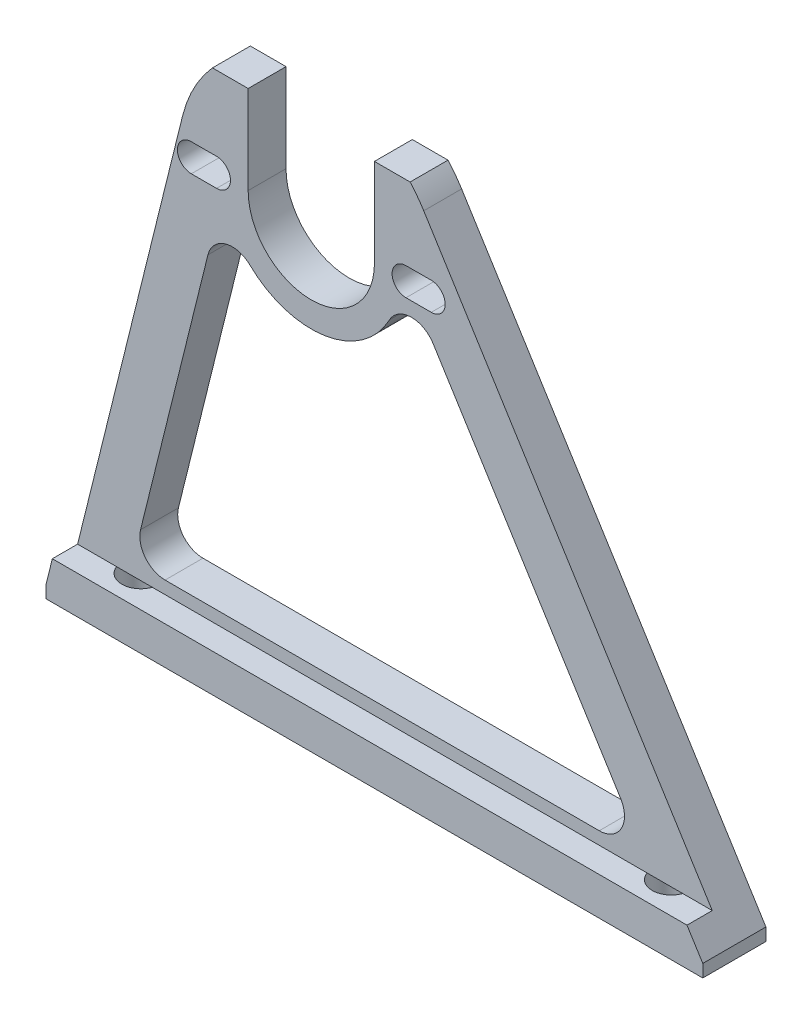
ISO-10303-21;
HEADER;
FILE_DESCRIPTION(('STEP AP214'),'2;1');
FILE_NAME('part.step','',(''),(''),'','','');
FILE_SCHEMA(('AUTOMOTIVE_DESIGN { 1 0 10303 214 1 1 1 1 }'));
ENDSEC;
DATA;
#1=APPLICATION_CONTEXT('core data for automotive mechanical design processes');
#2=APPLICATION_PROTOCOL_DEFINITION('international standard','automotive_design',2000,#1);
#3=PRODUCT_CONTEXT('',#1,'mechanical');
#4=PRODUCT('Part','Part','',(#3));
#5=PRODUCT_RELATED_PRODUCT_CATEGORY('part','',(#4));
#6=PRODUCT_DEFINITION_FORMATION('','',#4);
#7=PRODUCT_DEFINITION_CONTEXT('part definition',#1,'design');
#8=PRODUCT_DEFINITION('design','',#6,#7);
#9=PRODUCT_DEFINITION_SHAPE('','',#8);
#10=(LENGTH_UNIT() NAMED_UNIT(*) SI_UNIT(.MILLI.,.METRE.));
#11=(NAMED_UNIT(*) PLANE_ANGLE_UNIT() SI_UNIT($,.RADIAN.));
#12=(NAMED_UNIT(*) SI_UNIT($,.STERADIAN.) SOLID_ANGLE_UNIT());
#13=UNCERTAINTY_MEASURE_WITH_UNIT(LENGTH_MEASURE(1.E-05),#10,'distance_accuracy_value','');
#14=(GEOMETRIC_REPRESENTATION_CONTEXT(3) GLOBAL_UNCERTAINTY_ASSIGNED_CONTEXT((#13)) GLOBAL_UNIT_ASSIGNED_CONTEXT((#10,
#11,#12)) REPRESENTATION_CONTEXT('',''));
#15=CARTESIAN_POINT('',(0.,0.,0.));
#16=DIRECTION('',(0.,0.,1.));
#17=DIRECTION('',(1.,0.,0.));
#18=AXIS2_PLACEMENT_3D('',#15,#16,#17);
#19=CARTESIAN_POINT('',(0.,0.,5.));
#20=DIRECTION('',(0.,0.,-1.));
#21=DIRECTION('',(-1.,0.,0.));
#22=AXIS2_PLACEMENT_3D('',#19,#20,#21);
#23=CYLINDRICAL_SURFACE('',#22,10.5);
#24=CARTESIAN_POINT('',(0.,0.,3.));
#25=DIRECTION('',(0.,0.,1.));
#26=DIRECTION('',(1.,0.,0.));
#27=AXIS2_PLACEMENT_3D('',#24,#25,#26);
#28=CIRCLE('',#27,10.5);
#29=CARTESIAN_POINT('',(-7.82623792124927,7.,3.));
#30=VERTEX_POINT('',#29);
#31=CARTESIAN_POINT('',(-10.1914133471424,2.52687435138502,3.));
#32=VERTEX_POINT('',#31);
#33=EDGE_CURVE('E330',#30,#32,#28,.T.);
#34=ORIENTED_EDGE('',*,*,#33,.F.);
#35=DIRECTION('',(0.,0.,-1.));
#36=VECTOR('',#35,1.);
#37=CARTESIAN_POINT('',(-7.82623792124927,7.,5.));
#38=LINE('',#37,#36);
#39=CARTESIAN_POINT('',(-7.82623792124927,7.,0.));
#40=VERTEX_POINT('',#39);
#41=EDGE_CURVE('E430',#30,#40,#38,.T.);
#42=ORIENTED_EDGE('',*,*,#41,.T.);
#43=CARTESIAN_POINT('',(0.,0.,0.));
#44=DIRECTION('',(0.,0.,1.));
#45=DIRECTION('',(1.,0.,0.));
#46=AXIS2_PLACEMENT_3D('',#43,#44,#45);
#47=CIRCLE('',#46,10.5);
#48=CARTESIAN_POINT('',(-10.1914133471424,2.52687435138502,0.));
#49=VERTEX_POINT('',#48);
#50=EDGE_CURVE('E417',#40,#49,#47,.T.);
#51=ORIENTED_EDGE('',*,*,#50,.T.);
#52=DIRECTION('',(0.,0.,-1.));
#53=VECTOR('',#52,1.);
#54=CARTESIAN_POINT('',(-10.1914133471424,2.52687435138502,5.));
#55=LINE('',#54,#53);
#56=EDGE_CURVE('E486',#32,#49,#55,.T.);
#57=ORIENTED_EDGE('',*,*,#56,.F.);
#58=EDGE_LOOP('',(#34,#42,#51,#57));
#59=FACE_BOUND('',#58,.T.);
#60=ADVANCED_FACE('F34',(#59),#23,.T.);
#61=CARTESIAN_POINT('',(0.,0.,5.));
#62=DIRECTION('',(0.,0.,-1.));
#63=DIRECTION('',(-1.,0.,0.));
#64=AXIS2_PLACEMENT_3D('',#61,#62,#63);
#65=CYLINDRICAL_SURFACE('',#64,10.5);
#66=CARTESIAN_POINT('',(0.,0.,3.));
#67=DIRECTION('',(0.,0.,1.));
#68=DIRECTION('',(1.,0.,0.));
#69=AXIS2_PLACEMENT_3D('',#66,#67,#68);
#70=CIRCLE('',#69,10.5);
#71=CARTESIAN_POINT('',(8.90471895944788,5.56380986853878,3.));
#72=VERTEX_POINT('',#71);
#73=CARTESIAN_POINT('',(7.82623792124927,7.,3.));
#74=VERTEX_POINT('',#73);
#75=EDGE_CURVE('E326',#72,#74,#70,.T.);
#76=ORIENTED_EDGE('',*,*,#75,.F.);
#77=DIRECTION('',(0.,0.,-1.));
#78=VECTOR('',#77,1.);
#79=CARTESIAN_POINT('',(8.90471895944788,5.56380986853878,5.));
#80=LINE('',#79,#78);
#81=CARTESIAN_POINT('',(8.90471895944788,5.56380986853878,0.));
#82=VERTEX_POINT('',#81);
#83=EDGE_CURVE('E472',#72,#82,#80,.T.);
#84=ORIENTED_EDGE('',*,*,#83,.T.);
#85=CARTESIAN_POINT('',(0.,0.,0.));
#86=DIRECTION('',(0.,0.,1.));
#87=DIRECTION('',(1.,0.,0.));
#88=AXIS2_PLACEMENT_3D('',#85,#86,#87);
#89=CIRCLE('',#88,10.5);
#90=CARTESIAN_POINT('',(7.82623792124927,7.,0.));
#91=VERTEX_POINT('',#90);
#92=EDGE_CURVE('E444',#82,#91,#89,.T.);
#93=ORIENTED_EDGE('',*,*,#92,.T.);
#94=DIRECTION('',(0.,0.,-1.));
#95=VECTOR('',#94,1.);
#96=CARTESIAN_POINT('',(7.82623792124927,7.,5.));
#97=LINE('',#96,#95);
#98=EDGE_CURVE('E470',#74,#91,#97,.T.);
#99=ORIENTED_EDGE('',*,*,#98,.F.);
#100=EDGE_LOOP('',(#76,#84,#93,#99));
#101=FACE_BOUND('',#100,.T.);
#102=ADVANCED_FACE('F518',(#101),#65,.T.);
#103=CARTESIAN_POINT('',(5.,7.,5.));
#104=DIRECTION('',(0.,-1.,0.));
#105=DIRECTION('',(0.,0.,-1.));
#106=AXIS2_PLACEMENT_3D('',#103,#104,#105);
#107=PLANE('',#106);
#108=DIRECTION('',(-1.,0.,0.));
#109=VECTOR('',#108,1.);
#110=CARTESIAN_POINT('',(5.,7.,3.));
#111=LINE('',#110,#109);
#112=CARTESIAN_POINT('',(5.,7.,3.));
#113=VERTEX_POINT('',#112);
#114=EDGE_CURVE('E324',#74,#113,#111,.T.);
#115=ORIENTED_EDGE('',*,*,#114,.F.);
#116=ORIENTED_EDGE('',*,*,#98,.T.);
#117=DIRECTION('',(-1.,0.,0.));
#118=VECTOR('',#117,1.);
#119=CARTESIAN_POINT('',(5.,7.,0.));
#120=LINE('',#119,#118);
#121=CARTESIAN_POINT('',(5.,7.,0.));
#122=VERTEX_POINT('',#121);
#123=EDGE_CURVE('E447',#91,#122,#120,.T.);
#124=ORIENTED_EDGE('',*,*,#123,.T.);
#125=DIRECTION('',(0.,0.,-1.));
#126=VECTOR('',#125,1.);
#127=CARTESIAN_POINT('',(5.,7.,5.));
#128=LINE('',#127,#126);
#129=EDGE_CURVE('E468',#113,#122,#128,.T.);
#130=ORIENTED_EDGE('',*,*,#129,.F.);
#131=EDGE_LOOP('',(#115,#116,#124,#130));
#132=FACE_BOUND('',#131,.T.);
#133=ADVANCED_FACE('F523',(#132),#107,.F.);
#134=CARTESIAN_POINT('',(5.,0.,5.));
#135=DIRECTION('',(1.,0.,0.));
#136=DIRECTION('',(0.,1.,0.));
#137=AXIS2_PLACEMENT_3D('',#134,#135,#136);
#138=PLANE('',#137);
#139=DIRECTION('',(0.,-1.,0.));
#140=VECTOR('',#139,1.);
#141=CARTESIAN_POINT('',(5.,0.,3.));
#142=LINE('',#141,#140);
#143=CARTESIAN_POINT('',(5.,0.,3.));
#144=VERTEX_POINT('',#143);
#145=EDGE_CURVE('E322',#113,#144,#142,.T.);
#146=ORIENTED_EDGE('',*,*,#145,.F.);
#147=ORIENTED_EDGE('',*,*,#129,.T.);
#148=DIRECTION('',(0.,-1.,0.));
#149=VECTOR('',#148,1.);
#150=CARTESIAN_POINT('',(5.,0.,0.));
#151=LINE('',#150,#149);
#152=CARTESIAN_POINT('',(5.,0.,0.));
#153=VERTEX_POINT('',#152);
#154=EDGE_CURVE('E450',#122,#153,#151,.T.);
#155=ORIENTED_EDGE('',*,*,#154,.T.);
#156=DIRECTION('',(0.,0.,-1.));
#157=VECTOR('',#156,1.);
#158=CARTESIAN_POINT('',(5.,0.,5.));
#159=LINE('',#158,#157);
#160=EDGE_CURVE('E466',#144,#153,#159,.T.);
#161=ORIENTED_EDGE('',*,*,#160,.F.);
#162=EDGE_LOOP('',(#146,#147,#155,#161));
#163=FACE_BOUND('',#162,.T.);
#164=ADVANCED_FACE('F591',(#163),#138,.F.);
#165=CARTESIAN_POINT('',(0.,0.,5.));
#166=DIRECTION('',(0.,0.,-1.));
#167=DIRECTION('',(-1.,0.,0.));
#168=AXIS2_PLACEMENT_3D('',#165,#166,#167);
#169=CYLINDRICAL_SURFACE('',#168,5.);
#170=CARTESIAN_POINT('',(0.,0.,3.));
#171=DIRECTION('',(0.,0.,1.));
#172=DIRECTION('',(1.,0.,0.));
#173=AXIS2_PLACEMENT_3D('',#170,#171,#172);
#174=CIRCLE('',#173,5.);
#175=CARTESIAN_POINT('',(-5.,0.,3.));
#176=VERTEX_POINT('',#175);
#177=EDGE_CURVE('E320',#144,#176,#174,.F.);
#178=ORIENTED_EDGE('',*,*,#177,.F.);
#179=ORIENTED_EDGE('',*,*,#160,.T.);
#180=CARTESIAN_POINT('',(0.,0.,0.));
#181=DIRECTION('',(0.,0.,-1.));
#182=DIRECTION('',(1.,0.,0.));
#183=AXIS2_PLACEMENT_3D('',#180,#181,#182);
#184=CIRCLE('',#183,5.);
#185=CARTESIAN_POINT('',(-5.,0.,0.));
#186=VERTEX_POINT('',#185);
#187=EDGE_CURVE('E453',#153,#186,#184,.T.);
#188=ORIENTED_EDGE('',*,*,#187,.T.);
#189=DIRECTION('',(0.,0.,-1.));
#190=VECTOR('',#189,1.);
#191=CARTESIAN_POINT('',(-5.,0.,5.));
#192=LINE('',#191,#190);
#193=EDGE_CURVE('E464',#176,#186,#192,.T.);
#194=ORIENTED_EDGE('',*,*,#193,.F.);
#195=EDGE_LOOP('',(#178,#179,#188,#194));
#196=FACE_BOUND('',#195,.T.);
#197=ADVANCED_FACE('F594',(#196),#169,.F.);
#198=CARTESIAN_POINT('',(-5.,0.,5.));
#199=DIRECTION('',(-1.,0.,0.));
#200=DIRECTION('',(0.,-1.,0.));
#201=AXIS2_PLACEMENT_3D('',#198,#199,#200);
#202=PLANE('',#201);
#203=DIRECTION('',(0.,1.,0.));
#204=VECTOR('',#203,1.);
#205=CARTESIAN_POINT('',(-5.,0.,3.));
#206=LINE('',#205,#204);
#207=CARTESIAN_POINT('',(-5.,7.,3.));
#208=VERTEX_POINT('',#207);
#209=EDGE_CURVE('E318',#176,#208,#206,.T.);
#210=ORIENTED_EDGE('',*,*,#209,.F.);
#211=ORIENTED_EDGE('',*,*,#193,.T.);
#212=DIRECTION('',(0.,1.,0.));
#213=VECTOR('',#212,1.);
#214=CARTESIAN_POINT('',(-5.,0.,0.));
#215=LINE('',#214,#213);
#216=CARTESIAN_POINT('',(-5.,7.,0.));
#217=VERTEX_POINT('',#216);
#218=EDGE_CURVE('E456',#186,#217,#215,.T.);
#219=ORIENTED_EDGE('',*,*,#218,.T.);
#220=DIRECTION('',(0.,0.,-1.));
#221=VECTOR('',#220,1.);
#222=CARTESIAN_POINT('',(-5.,7.,5.));
#223=LINE('',#222,#221);
#224=EDGE_CURVE('E462',#208,#217,#223,.T.);
#225=ORIENTED_EDGE('',*,*,#224,.F.);
#226=EDGE_LOOP('',(#210,#211,#219,#225));
#227=FACE_BOUND('',#226,.T.);
#228=ADVANCED_FACE('F598',(#227),#202,.F.);
#229=CARTESIAN_POINT('',(-7.82623792124927,7.,5.));
#230=DIRECTION('',(0.,-1.,0.));
#231=DIRECTION('',(1.,0.,0.));
#232=AXIS2_PLACEMENT_3D('',#229,#230,#231);
#233=PLANE('',#232);
#234=DIRECTION('',(-1.,0.,0.));
#235=VECTOR('',#234,1.);
#236=CARTESIAN_POINT('',(-7.82623792124927,7.,3.));
#237=LINE('',#236,#235);
#238=EDGE_CURVE('E316',#208,#30,#237,.T.);
#239=ORIENTED_EDGE('',*,*,#238,.F.);
#240=ORIENTED_EDGE('',*,*,#224,.T.);
#241=DIRECTION('',(-1.,0.,0.));
#242=VECTOR('',#241,1.);
#243=CARTESIAN_POINT('',(-7.82623792124927,7.,0.));
#244=LINE('',#243,#242);
#245=EDGE_CURVE('E421',#217,#40,#244,.T.);
#246=ORIENTED_EDGE('',*,*,#245,.T.);
#247=ORIENTED_EDGE('',*,*,#41,.F.);
#248=EDGE_LOOP('',(#239,#240,#246,#247));
#249=FACE_BOUND('',#248,.T.);
#250=ADVANCED_FACE('F532',(#249),#233,.F.);
#251=CARTESIAN_POINT('',(-8.45269707809848,-7.0818439433983,5.));
#252=DIRECTION('',(0.970610794965944,-0.240654700131907,0.));
#253=DIRECTION('',(0.240654700131907,0.970610794965944,0.));
#254=AXIS2_PLACEMENT_3D('',#251,#252,#253);
#255=PLANE('',#254);
#256=DIRECTION('',(0.,0.,-1.));
#257=VECTOR('',#256,1.);
#258=CARTESIAN_POINT('',(-8.18468792196786,-6.00090689979386,5.));
#259=LINE('',#258,#257);
#260=CARTESIAN_POINT('',(-8.18468792196786,-6.00090689979386,3.));
#261=VERTEX_POINT('',#260);
#262=CARTESIAN_POINT('',(-8.18468792196786,-6.00090689979386,0.));
#263=VERTEX_POINT('',#262);
#264=EDGE_CURVE('E401',#261,#263,#259,.T.);
#265=ORIENTED_EDGE('',*,*,#264,.F.);
#266=DIRECTION('',(-0.240654700131907,-0.970610794965944,0.));
#267=VECTOR('',#266,1.);
#268=CARTESIAN_POINT('',(-8.45269707809848,-7.0818439433983,3.));
#269=LINE('',#268,#267);
#270=CARTESIAN_POINT('',(-13.5198395714965,-27.5186905997362,3.));
#271=VERTEX_POINT('',#270);
#272=EDGE_CURVE('E313',#261,#271,#269,.T.);
#273=ORIENTED_EDGE('',*,*,#272,.T.);
#274=DIRECTION('',(0.,0.,-1.));
#275=VECTOR('',#274,1.);
#276=CARTESIAN_POINT('',(-13.5198395714965,-27.5186905997362,5.));
#277=LINE('',#276,#275);
#278=CARTESIAN_POINT('',(-13.5198395714965,-27.5186905997362,0.));
#279=VERTEX_POINT('',#278);
#280=EDGE_CURVE('E415',#271,#279,#277,.T.);
#281=ORIENTED_EDGE('',*,*,#280,.T.);
#282=DIRECTION('',(-0.240654700131907,-0.970610794965944,0.));
#283=VECTOR('',#282,1.);
#284=CARTESIAN_POINT('',(-8.45269707809848,-7.0818439433983,0.));
#285=LINE('',#284,#283);
#286=EDGE_CURVE('E377',#263,#279,#285,.T.);
#287=ORIENTED_EDGE('',*,*,#286,.F.);
#288=EDGE_LOOP('',(#265,#273,#281,#287));
#289=FACE_BOUND('',#288,.T.);
#290=ADVANCED_FACE('F605',(#289),#255,.T.);
#291=CARTESIAN_POINT('',(-11.5786179815646,-28.,5.));
#292=DIRECTION('',(0.,0.,-1.));
#293=DIRECTION('',(-1.,0.,0.));
#294=AXIS2_PLACEMENT_3D('',#291,#292,#293);
#295=CYLINDRICAL_SURFACE('',#294,2.);
#296=ORIENTED_EDGE('',*,*,#280,.F.);
#297=CARTESIAN_POINT('',(-11.5786179815646,-28.,3.));
#298=DIRECTION('',(0.,0.,1.));
#299=DIRECTION('',(1.,0.,0.));
#300=AXIS2_PLACEMENT_3D('',#297,#298,#299);
#301=CIRCLE('',#300,2.);
#302=CARTESIAN_POINT('',(-11.5786179815646,-30.,3.));
#303=VERTEX_POINT('',#302);
#304=EDGE_CURVE('E310',#271,#303,#301,.T.);
#305=ORIENTED_EDGE('',*,*,#304,.T.);
#306=DIRECTION('',(0.,0.,-1.));
#307=VECTOR('',#306,1.);
#308=CARTESIAN_POINT('',(-11.5786179815646,-30.,5.));
#309=LINE('',#308,#307);
#310=CARTESIAN_POINT('',(-11.5786179815646,-30.,0.));
#311=VERTEX_POINT('',#310);
#312=EDGE_CURVE('E413',#303,#311,#309,.T.);
#313=ORIENTED_EDGE('',*,*,#312,.T.);
#314=CARTESIAN_POINT('',(-11.5786179815646,-28.,0.));
#315=DIRECTION('',(0.,0.,1.));
#316=DIRECTION('',(-1.,0.,0.));
#317=AXIS2_PLACEMENT_3D('',#314,#315,#316);
#318=CIRCLE('',#317,2.);
#319=EDGE_CURVE('E380',#279,#311,#318,.T.);
#320=ORIENTED_EDGE('',*,*,#319,.F.);
#321=EDGE_LOOP('',(#296,#305,#313,#320));
#322=FACE_BOUND('',#321,.T.);
#323=ADVANCED_FACE('F631',(#322),#295,.F.);
#324=CARTESIAN_POINT('',(-11.5786179815646,-30.,5.));
#325=DIRECTION('',(0.,1.,0.));
#326=DIRECTION('',(0.,0.,1.));
#327=AXIS2_PLACEMENT_3D('',#324,#325,#326);
#328=PLANE('',#327);
#329=ORIENTED_EDGE('',*,*,#312,.F.);
#330=DIRECTION('',(1.,0.,0.));
#331=VECTOR('',#330,1.);
#332=CARTESIAN_POINT('',(-11.5786179815646,-30.,3.));
#333=LINE('',#332,#331);
#334=CARTESIAN_POINT('',(22.8010201381667,-30.,3.));
#335=VERTEX_POINT('',#334);
#336=EDGE_CURVE('E307',#303,#335,#333,.T.);
#337=ORIENTED_EDGE('',*,*,#336,.T.);
#338=DIRECTION('',(0.,0.,-1.));
#339=VECTOR('',#338,1.);
#340=CARTESIAN_POINT('',(22.8010201381667,-30.,5.));
#341=LINE('',#340,#339);
#342=CARTESIAN_POINT('',(22.8010201381667,-30.,0.));
#343=VERTEX_POINT('',#342);
#344=EDGE_CURVE('E411',#335,#343,#341,.T.);
#345=ORIENTED_EDGE('',*,*,#344,.T.);
#346=DIRECTION('',(1.,0.,0.));
#347=VECTOR('',#346,1.);
#348=CARTESIAN_POINT('',(-11.5786179815646,-30.,0.));
#349=LINE('',#348,#347);
#350=EDGE_CURVE('E383',#311,#343,#349,.T.);
#351=ORIENTED_EDGE('',*,*,#350,.F.);
#352=EDGE_LOOP('',(#329,#337,#345,#351));
#353=FACE_BOUND('',#352,.T.);
#354=ADVANCED_FACE('F635',(#353),#328,.T.);
#355=CARTESIAN_POINT('',(22.8010201381667,-28.,5.));
#356=DIRECTION('',(0.,0.,-1.));
#357=DIRECTION('',(-1.,0.,0.));
#358=AXIS2_PLACEMENT_3D('',#355,#356,#357);
#359=CYLINDRICAL_SURFACE('',#358,2.);
#360=ORIENTED_EDGE('',*,*,#344,.F.);
#361=CARTESIAN_POINT('',(22.8010201381667,-28.,3.));
#362=DIRECTION('',(0.,0.,1.));
#363=DIRECTION('',(1.,0.,0.));
#364=AXIS2_PLACEMENT_3D('',#361,#362,#363);
#365=CIRCLE('',#364,2.);
#366=CARTESIAN_POINT('',(24.4971570828234,-26.9402266917069,3.));
#367=VERTEX_POINT('',#366);
#368=EDGE_CURVE('E304',#335,#367,#365,.T.);
#369=ORIENTED_EDGE('',*,*,#368,.T.);
#370=DIRECTION('',(0.,0.,-1.));
#371=VECTOR('',#370,1.);
#372=CARTESIAN_POINT('',(24.4971570828234,-26.9402266917069,5.));
#373=LINE('',#372,#371);
#374=CARTESIAN_POINT('',(24.4971570828234,-26.9402266917069,0.));
#375=VERTEX_POINT('',#374);
#376=EDGE_CURVE('E409',#367,#375,#373,.T.);
#377=ORIENTED_EDGE('',*,*,#376,.T.);
#378=CARTESIAN_POINT('',(22.8010201381667,-28.,0.));
#379=DIRECTION('',(0.,0.,1.));
#380=DIRECTION('',(1.,0.,0.));
#381=AXIS2_PLACEMENT_3D('',#378,#379,#380);
#382=CIRCLE('',#381,2.);
#383=EDGE_CURVE('E386',#343,#375,#382,.T.);
#384=ORIENTED_EDGE('',*,*,#383,.F.);
#385=EDGE_LOOP('',(#360,#369,#377,#384));
#386=FACE_BOUND('',#385,.T.);
#387=ADVANCED_FACE('F639',(#386),#359,.F.);
#388=CARTESIAN_POINT('',(24.4971570828234,-26.9402266917069,5.));
#389=DIRECTION('',(-0.848068472328369,-0.529886654146551,0.));
#390=DIRECTION('',(0.529886654146551,-0.848068472328369,0.));
#391=AXIS2_PLACEMENT_3D('',#388,#389,#390);
#392=PLANE('',#391);
#393=ORIENTED_EDGE('',*,*,#376,.F.);
#394=DIRECTION('',(-0.529886654146551,0.848068472328369,0.));
#395=VECTOR('',#394,1.);
#396=CARTESIAN_POINT('',(24.4971570828234,-26.9402266917069,3.));
#397=LINE('',#396,#395);
#398=CARTESIAN_POINT('',(9.64250280268966,-3.16577631871268,3.));
#399=VERTEX_POINT('',#398);
#400=EDGE_CURVE('E301',#367,#399,#397,.T.);
#401=ORIENTED_EDGE('',*,*,#400,.T.);
#402=DIRECTION('',(0.,0.,-1.));
#403=VECTOR('',#402,1.);
#404=CARTESIAN_POINT('',(9.64250280268966,-3.16577631871268,5.));
#405=LINE('',#404,#403);
#406=CARTESIAN_POINT('',(9.64250280268966,-3.16577631871268,0.));
#407=VERTEX_POINT('',#406);
#408=EDGE_CURVE('E407',#399,#407,#405,.T.);
#409=ORIENTED_EDGE('',*,*,#408,.T.);
#410=DIRECTION('',(-0.529886654146551,0.848068472328369,0.));
#411=VECTOR('',#410,1.);
#412=CARTESIAN_POINT('',(24.4971570828234,-26.9402266917069,0.));
#413=LINE('',#412,#411);
#414=EDGE_CURVE('E389',#375,#407,#413,.T.);
#415=ORIENTED_EDGE('',*,*,#414,.F.);
#416=EDGE_LOOP('',(#393,#401,#409,#415));
#417=FACE_BOUND('',#416,.T.);
#418=ADVANCED_FACE('F643',(#417),#392,.T.);
#419=CARTESIAN_POINT('',(7.94636585803292,-4.22554962700578,5.));
#420=DIRECTION('',(0.,0.,-1.));
#421=DIRECTION('',(-1.,0.,0.));
#422=AXIS2_PLACEMENT_3D('',#419,#420,#421);
#423=CYLINDRICAL_SURFACE('',#422,2.);
#424=ORIENTED_EDGE('',*,*,#408,.F.);
#425=CARTESIAN_POINT('',(7.94636585803292,-4.22554962700578,3.));
#426=DIRECTION('',(0.,0.,1.));
#427=DIRECTION('',(1.,0.,0.));
#428=AXIS2_PLACEMENT_3D('',#425,#426,#427);
#429=CIRCLE('',#428,2.);
#430=CARTESIAN_POINT('',(6.18050677847005,-3.28653859878227,3.));
#431=VERTEX_POINT('',#430);
#432=EDGE_CURVE('E298',#399,#431,#429,.T.);
#433=ORIENTED_EDGE('',*,*,#432,.T.);
#434=DIRECTION('',(0.,0.,-1.));
#435=VECTOR('',#434,1.);
#436=CARTESIAN_POINT('',(6.18050677847005,-3.28653859878227,5.));
#437=LINE('',#436,#435);
#438=CARTESIAN_POINT('',(6.18050677847005,-3.28653859878227,0.));
#439=VERTEX_POINT('',#438);
#440=EDGE_CURVE('E405',#431,#439,#437,.T.);
#441=ORIENTED_EDGE('',*,*,#440,.T.);
#442=CARTESIAN_POINT('',(7.94636585803292,-4.22554962700578,0.));
#443=DIRECTION('',(0.,0.,1.));
#444=DIRECTION('',(1.,0.,0.));
#445=AXIS2_PLACEMENT_3D('',#442,#443,#444);
#446=CIRCLE('',#445,2.);
#447=EDGE_CURVE('E392',#407,#439,#446,.T.);
#448=ORIENTED_EDGE('',*,*,#447,.F.);
#449=EDGE_LOOP('',(#424,#433,#441,#448));
#450=FACE_BOUND('',#449,.T.);
#451=ADVANCED_FACE('F647',(#450),#423,.F.);
#452=CARTESIAN_POINT('',(0.,0.,5.));
#453=DIRECTION('',(0.,0.,-1.));
#454=DIRECTION('',(-1.,0.,0.));
#455=AXIS2_PLACEMENT_3D('',#452,#453,#454);
#456=CYLINDRICAL_SURFACE('',#455,7.);
#457=ORIENTED_EDGE('',*,*,#440,.F.);
#458=CARTESIAN_POINT('',(0.,0.,3.));
#459=DIRECTION('',(0.,0.,1.));
#460=DIRECTION('',(1.,0.,0.));
#461=AXIS2_PLACEMENT_3D('',#458,#459,#460);
#462=CIRCLE('',#461,7.);
#463=CARTESIAN_POINT('',(-4.85602936936131,-5.04172378893374,3.));
#464=VERTEX_POINT('',#463);
#465=EDGE_CURVE('E295',#431,#464,#462,.F.);
#466=ORIENTED_EDGE('',*,*,#465,.T.);
#467=DIRECTION('',(0.,0.,-1.));
#468=VECTOR('',#467,1.);
#469=CARTESIAN_POINT('',(-4.85602936936131,-5.04172378893374,5.));
#470=LINE('',#469,#468);
#471=CARTESIAN_POINT('',(-4.85602936936131,-5.04172378893374,0.));
#472=VERTEX_POINT('',#471);
#473=EDGE_CURVE('E403',#464,#472,#470,.T.);
#474=ORIENTED_EDGE('',*,*,#473,.T.);
#475=CARTESIAN_POINT('',(0.,0.,0.));
#476=DIRECTION('',(0.,0.,-1.));
#477=DIRECTION('',(1.,0.,0.));
#478=AXIS2_PLACEMENT_3D('',#475,#476,#477);
#479=CIRCLE('',#478,7.);
#480=EDGE_CURVE('E395',#439,#472,#479,.T.);
#481=ORIENTED_EDGE('',*,*,#480,.F.);
#482=EDGE_LOOP('',(#457,#466,#474,#481));
#483=FACE_BOUND('',#482,.T.);
#484=ADVANCED_FACE('F651',(#483),#456,.T.);
#485=CARTESIAN_POINT('',(-6.24346633203597,-6.48221630005767,5.));
#486=DIRECTION('',(0.,0.,-1.));
#487=DIRECTION('',(-1.,0.,0.));
#488=AXIS2_PLACEMENT_3D('',#485,#486,#487);
#489=CYLINDRICAL_SURFACE('',#488,2.);
#490=ORIENTED_EDGE('',*,*,#473,.F.);
#491=CARTESIAN_POINT('',(-6.24346633203597,-6.48221630005767,3.));
#492=DIRECTION('',(0.,0.,1.));
#493=DIRECTION('',(1.,0.,0.));
#494=AXIS2_PLACEMENT_3D('',#491,#492,#493);
#495=CIRCLE('',#494,2.);
#496=EDGE_CURVE('E292',#464,#261,#495,.T.);
#497=ORIENTED_EDGE('',*,*,#496,.T.);
#498=ORIENTED_EDGE('',*,*,#264,.T.);
#499=CARTESIAN_POINT('',(-6.24346633203597,-6.48221630005767,0.));
#500=DIRECTION('',(0.,0.,1.));
#501=DIRECTION('',(-1.,0.,0.));
#502=AXIS2_PLACEMENT_3D('',#499,#500,#501);
#503=CIRCLE('',#502,2.);
#504=EDGE_CURVE('E398',#472,#263,#503,.T.);
#505=ORIENTED_EDGE('',*,*,#504,.F.);
#506=EDGE_LOOP('',(#490,#497,#498,#505));
#507=FACE_BOUND('',#506,.T.);
#508=ADVANCED_FACE('F655',(#507),#489,.F.);
#509=CARTESIAN_POINT('',(-9.5,0.,5.));
#510=DIRECTION('',(0.,0.,-1.));
#511=DIRECTION('',(-1.,0.,0.));
#512=AXIS2_PLACEMENT_3D('',#509,#510,#511);
#513=CYLINDRICAL_SURFACE('',#512,1.1);
#514=DIRECTION('',(0.,0.,-1.));
#515=VECTOR('',#514,1.);
#516=CARTESIAN_POINT('',(-9.5,1.09999999999999,5.));
#517=LINE('',#516,#515);
#518=CARTESIAN_POINT('',(-9.5,1.09999999999999,3.));
#519=VERTEX_POINT('',#518);
#520=CARTESIAN_POINT('',(-9.5,1.09999999999999,0.));
#521=VERTEX_POINT('',#520);
#522=EDGE_CURVE('E369',#519,#521,#517,.T.);
#523=ORIENTED_EDGE('',*,*,#522,.F.);
#524=CARTESIAN_POINT('',(-9.5,0.,3.));
#525=DIRECTION('',(0.,0.,1.));
#526=DIRECTION('',(1.,0.,0.));
#527=AXIS2_PLACEMENT_3D('',#524,#525,#526);
#528=CIRCLE('',#527,1.1);
#529=CARTESIAN_POINT('',(-9.5,-1.10000000000001,3.));
#530=VERTEX_POINT('',#529);
#531=EDGE_CURVE('E289',#519,#530,#528,.T.);
#532=ORIENTED_EDGE('',*,*,#531,.T.);
#533=DIRECTION('',(0.,0.,-1.));
#534=VECTOR('',#533,1.);
#535=CARTESIAN_POINT('',(-9.5,-1.10000000000001,5.));
#536=LINE('',#535,#534);
#537=CARTESIAN_POINT('',(-9.5,-1.10000000000001,0.));
#538=VERTEX_POINT('',#537);
#539=EDGE_CURVE('E375',#530,#538,#536,.T.);
#540=ORIENTED_EDGE('',*,*,#539,.T.);
#541=CARTESIAN_POINT('',(-9.5,0.,0.));
#542=DIRECTION('',(0.,0.,1.));
#543=DIRECTION('',(1.,0.,0.));
#544=AXIS2_PLACEMENT_3D('',#541,#542,#543);
#545=CIRCLE('',#544,1.1);
#546=EDGE_CURVE('E357',#521,#538,#545,.T.);
#547=ORIENTED_EDGE('',*,*,#546,.F.);
#548=EDGE_LOOP('',(#523,#532,#540,#547));
#549=FACE_BOUND('',#548,.T.);
#550=ADVANCED_FACE('F659',(#549),#513,.F.);
#551=CARTESIAN_POINT('',(-9.5,-1.10000000000001,5.));
#552=DIRECTION('',(0.,1.,0.));
#553=DIRECTION('',(-1.,0.,0.));
#554=AXIS2_PLACEMENT_3D('',#551,#552,#553);
#555=PLANE('',#554);
#556=ORIENTED_EDGE('',*,*,#539,.F.);
#557=DIRECTION('',(1.,0.,0.));
#558=VECTOR('',#557,1.);
#559=CARTESIAN_POINT('',(-9.5,-1.10000000000001,3.));
#560=LINE('',#559,#558);
#561=CARTESIAN_POINT('',(-7.5,-1.1,3.));
#562=VERTEX_POINT('',#561);
#563=EDGE_CURVE('E286',#530,#562,#560,.T.);
#564=ORIENTED_EDGE('',*,*,#563,.T.);
#565=DIRECTION('',(0.,0.,-1.));
#566=VECTOR('',#565,1.);
#567=CARTESIAN_POINT('',(-7.5,-1.1,5.));
#568=LINE('',#567,#566);
#569=CARTESIAN_POINT('',(-7.5,-1.1,0.));
#570=VERTEX_POINT('',#569);
#571=EDGE_CURVE('E373',#562,#570,#568,.T.);
#572=ORIENTED_EDGE('',*,*,#571,.T.);
#573=DIRECTION('',(1.,0.,0.));
#574=VECTOR('',#573,1.);
#575=CARTESIAN_POINT('',(-9.5,-1.10000000000001,0.));
#576=LINE('',#575,#574);
#577=EDGE_CURVE('E360',#538,#570,#576,.T.);
#578=ORIENTED_EDGE('',*,*,#577,.F.);
#579=EDGE_LOOP('',(#556,#564,#572,#578));
#580=FACE_BOUND('',#579,.T.);
#581=ADVANCED_FACE('F663',(#580),#555,.T.);
#582=CARTESIAN_POINT('',(-7.5,0.,5.));
#583=DIRECTION('',(0.,0.,-1.));
#584=DIRECTION('',(-1.,0.,0.));
#585=AXIS2_PLACEMENT_3D('',#582,#583,#584);
#586=CYLINDRICAL_SURFACE('',#585,1.1);
#587=ORIENTED_EDGE('',*,*,#571,.F.);
#588=CARTESIAN_POINT('',(-7.5,0.,3.));
#589=DIRECTION('',(0.,0.,1.));
#590=DIRECTION('',(1.,0.,0.));
#591=AXIS2_PLACEMENT_3D('',#588,#589,#590);
#592=CIRCLE('',#591,1.1);
#593=CARTESIAN_POINT('',(-7.5,1.1,3.));
#594=VERTEX_POINT('',#593);
#595=EDGE_CURVE('E283',#562,#594,#592,.T.);
#596=ORIENTED_EDGE('',*,*,#595,.T.);
#597=DIRECTION('',(0.,0.,-1.));
#598=VECTOR('',#597,1.);
#599=CARTESIAN_POINT('',(-7.5,1.1,5.));
#600=LINE('',#599,#598);
#601=CARTESIAN_POINT('',(-7.5,1.1,0.));
#602=VERTEX_POINT('',#601);
#603=EDGE_CURVE('E371',#594,#602,#600,.T.);
#604=ORIENTED_EDGE('',*,*,#603,.T.);
#605=CARTESIAN_POINT('',(-7.5,0.,0.));
#606=DIRECTION('',(0.,0.,1.));
#607=DIRECTION('',(1.,0.,0.));
#608=AXIS2_PLACEMENT_3D('',#605,#606,#607);
#609=CIRCLE('',#608,1.1);
#610=EDGE_CURVE('E363',#570,#602,#609,.T.);
#611=ORIENTED_EDGE('',*,*,#610,.F.);
#612=EDGE_LOOP('',(#587,#596,#604,#611));
#613=FACE_BOUND('',#612,.T.);
#614=ADVANCED_FACE('F667',(#613),#586,.F.);
#615=CARTESIAN_POINT('',(-9.5,1.09999999999999,5.));
#616=DIRECTION('',(0.,-1.,0.));
#617=DIRECTION('',(1.,0.,0.));
#618=AXIS2_PLACEMENT_3D('',#615,#616,#617);
#619=PLANE('',#618);
#620=ORIENTED_EDGE('',*,*,#603,.F.);
#621=DIRECTION('',(-1.,0.,0.));
#622=VECTOR('',#621,1.);
#623=CARTESIAN_POINT('',(-9.5,1.09999999999999,3.));
#624=LINE('',#623,#622);
#625=EDGE_CURVE('E280',#594,#519,#624,.T.);
#626=ORIENTED_EDGE('',*,*,#625,.T.);
#627=ORIENTED_EDGE('',*,*,#522,.T.);
#628=DIRECTION('',(-1.,0.,0.));
#629=VECTOR('',#628,1.);
#630=CARTESIAN_POINT('',(-9.5,1.09999999999999,0.));
#631=LINE('',#630,#629);
#632=EDGE_CURVE('E366',#602,#521,#631,.T.);
#633=ORIENTED_EDGE('',*,*,#632,.F.);
#634=EDGE_LOOP('',(#620,#626,#627,#633));
#635=FACE_BOUND('',#634,.T.);
#636=ADVANCED_FACE('F515',(#635),#619,.T.);
#637=CARTESIAN_POINT('',(9.5,0.,5.));
#638=DIRECTION('',(0.,0.,-1.));
#639=DIRECTION('',(-1.,0.,0.));
#640=AXIS2_PLACEMENT_3D('',#637,#638,#639);
#641=CYLINDRICAL_SURFACE('',#640,1.1);
#642=DIRECTION('',(0.,0.,-1.));
#643=VECTOR('',#642,1.);
#644=CARTESIAN_POINT('',(9.5,-1.10000000000001,5.));
#645=LINE('',#644,#643);
#646=CARTESIAN_POINT('',(9.5,-1.10000000000001,3.));
#647=VERTEX_POINT('',#646);
#648=CARTESIAN_POINT('',(9.5,-1.10000000000001,0.));
#649=VERTEX_POINT('',#648);
#650=EDGE_CURVE('E349',#647,#649,#645,.T.);
#651=ORIENTED_EDGE('',*,*,#650,.F.);
#652=CARTESIAN_POINT('',(9.5,0.,3.));
#653=DIRECTION('',(0.,0.,1.));
#654=DIRECTION('',(1.,0.,0.));
#655=AXIS2_PLACEMENT_3D('',#652,#653,#654);
#656=CIRCLE('',#655,1.1);
#657=CARTESIAN_POINT('',(9.5,1.09999999999999,3.));
#658=VERTEX_POINT('',#657);
#659=EDGE_CURVE('E277',#647,#658,#656,.T.);
#660=ORIENTED_EDGE('',*,*,#659,.T.);
#661=DIRECTION('',(0.,0.,-1.));
#662=VECTOR('',#661,1.);
#663=CARTESIAN_POINT('',(9.5,1.09999999999999,5.));
#664=LINE('',#663,#662);
#665=CARTESIAN_POINT('',(9.5,1.09999999999999,0.));
#666=VERTEX_POINT('',#665);
#667=EDGE_CURVE('E355',#658,#666,#664,.T.);
#668=ORIENTED_EDGE('',*,*,#667,.T.);
#669=CARTESIAN_POINT('',(9.5,0.,0.));
#670=DIRECTION('',(0.,0.,1.));
#671=DIRECTION('',(-1.,0.,0.));
#672=AXIS2_PLACEMENT_3D('',#669,#670,#671);
#673=CIRCLE('',#672,1.1);
#674=EDGE_CURVE('E337',#649,#666,#673,.T.);
#675=ORIENTED_EDGE('',*,*,#674,.F.);
#676=EDGE_LOOP('',(#651,#660,#668,#675));
#677=FACE_BOUND('',#676,.T.);
#678=ADVANCED_FACE('F496',(#677),#641,.F.);
#679=CARTESIAN_POINT('',(9.5,1.09999999999999,5.));
#680=DIRECTION('',(0.,-1.,0.));
#681=DIRECTION('',(1.,0.,0.));
#682=AXIS2_PLACEMENT_3D('',#679,#680,#681);
#683=PLANE('',#682);
#684=ORIENTED_EDGE('',*,*,#667,.F.);
#685=DIRECTION('',(-1.,0.,0.));
#686=VECTOR('',#685,1.);
#687=CARTESIAN_POINT('',(9.5,1.09999999999999,3.));
#688=LINE('',#687,#686);
#689=CARTESIAN_POINT('',(7.5,1.1,3.));
#690=VERTEX_POINT('',#689);
#691=EDGE_CURVE('E274',#658,#690,#688,.T.);
#692=ORIENTED_EDGE('',*,*,#691,.T.);
#693=DIRECTION('',(0.,0.,-1.));
#694=VECTOR('',#693,1.);
#695=CARTESIAN_POINT('',(7.5,1.1,5.));
#696=LINE('',#695,#694);
#697=CARTESIAN_POINT('',(7.5,1.1,0.));
#698=VERTEX_POINT('',#697);
#699=EDGE_CURVE('E353',#690,#698,#696,.T.);
#700=ORIENTED_EDGE('',*,*,#699,.T.);
#701=DIRECTION('',(-1.,0.,0.));
#702=VECTOR('',#701,1.);
#703=CARTESIAN_POINT('',(9.5,1.09999999999999,0.));
#704=LINE('',#703,#702);
#705=EDGE_CURVE('E340',#666,#698,#704,.T.);
#706=ORIENTED_EDGE('',*,*,#705,.F.);
#707=EDGE_LOOP('',(#684,#692,#700,#706));
#708=FACE_BOUND('',#707,.T.);
#709=ADVANCED_FACE('F507',(#708),#683,.T.);
#710=CARTESIAN_POINT('',(7.5,0.,5.));
#711=DIRECTION('',(0.,0.,-1.));
#712=DIRECTION('',(-1.,0.,0.));
#713=AXIS2_PLACEMENT_3D('',#710,#711,#712);
#714=CYLINDRICAL_SURFACE('',#713,1.1);
#715=ORIENTED_EDGE('',*,*,#699,.F.);
#716=CARTESIAN_POINT('',(7.5,0.,3.));
#717=DIRECTION('',(0.,0.,1.));
#718=DIRECTION('',(1.,0.,0.));
#719=AXIS2_PLACEMENT_3D('',#716,#717,#718);
#720=CIRCLE('',#719,1.1);
#721=CARTESIAN_POINT('',(7.5,-1.1,3.));
#722=VERTEX_POINT('',#721);
#723=EDGE_CURVE('E268',#690,#722,#720,.T.);
#724=ORIENTED_EDGE('',*,*,#723,.T.);
#725=DIRECTION('',(0.,0.,-1.));
#726=VECTOR('',#725,1.);
#727=CARTESIAN_POINT('',(7.5,-1.1,5.));
#728=LINE('',#727,#726);
#729=CARTESIAN_POINT('',(7.5,-1.1,0.));
#730=VERTEX_POINT('',#729);
#731=EDGE_CURVE('E351',#722,#730,#728,.T.);
#732=ORIENTED_EDGE('',*,*,#731,.T.);
#733=CARTESIAN_POINT('',(7.5,0.,0.));
#734=DIRECTION('',(0.,0.,1.));
#735=DIRECTION('',(-1.,0.,0.));
#736=AXIS2_PLACEMENT_3D('',#733,#734,#735);
#737=CIRCLE('',#736,1.1);
#738=EDGE_CURVE('E343',#698,#730,#737,.T.);
#739=ORIENTED_EDGE('',*,*,#738,.F.);
#740=EDGE_LOOP('',(#715,#724,#732,#739));
#741=FACE_BOUND('',#740,.T.);
#742=ADVANCED_FACE('F504',(#741),#714,.F.);
#743=CARTESIAN_POINT('',(9.5,-1.10000000000001,5.));
#744=DIRECTION('',(0.,1.,0.));
#745=DIRECTION('',(-1.,0.,0.));
#746=AXIS2_PLACEMENT_3D('',#743,#744,#745);
#747=PLANE('',#746);
#748=ORIENTED_EDGE('',*,*,#731,.F.);
#749=DIRECTION('',(1.,0.,0.));
#750=VECTOR('',#749,1.);
#751=CARTESIAN_POINT('',(9.5,-1.10000000000001,3.));
#752=LINE('',#751,#750);
#753=EDGE_CURVE('E41',#722,#647,#752,.T.);
#754=ORIENTED_EDGE('',*,*,#753,.T.);
#755=ORIENTED_EDGE('',*,*,#650,.T.);
#756=DIRECTION('',(1.,0.,0.));
#757=VECTOR('',#756,1.);
#758=CARTESIAN_POINT('',(9.5,-1.10000000000001,0.));
#759=LINE('',#758,#757);
#760=EDGE_CURVE('E346',#730,#649,#759,.T.);
#761=ORIENTED_EDGE('',*,*,#760,.F.);
#762=EDGE_LOOP('',(#748,#754,#755,#761));
#763=FACE_BOUND('',#762,.T.);
#764=ADVANCED_FACE('F491',(#763),#747,.T.);
#765=CARTESIAN_POINT('',(0.,0.,5.));
#766=DIRECTION('',(0.,0.,1.));
#767=DIRECTION('',(1.,0.,0.));
#768=AXIS2_PLACEMENT_3D('',#765,#766,#767);
#769=PLANE('',#768);
#770=DIRECTION('',(1.,0.,0.));
#771=VECTOR('',#770,1.);
#772=CARTESIAN_POINT('',(54.2961840779549,-31.,5.));
#773=LINE('',#772,#771);
#774=CARTESIAN_POINT('',(-18.5041169923515,-31.,5.));
#775=VERTEX_POINT('',#774);
#776=CARTESIAN_POINT('',(31.7503682274811,-31.,5.));
#777=VERTEX_POINT('',#776);
#778=EDGE_CURVE('E270',#775,#777,#773,.T.);
#779=ORIENTED_EDGE('',*,*,#778,.F.);
#780=DIRECTION('',(-0.240654700131907,-0.970610794965944,0.));
#781=VECTOR('',#780,1.);
#782=CARTESIAN_POINT('',(-10.1914133471424,2.52687435138502,5.));
#783=LINE('',#782,#781);
#784=CARTESIAN_POINT('',(-19.,-33.,5.));
#785=VERTEX_POINT('',#784);
#786=EDGE_CURVE('E418',#775,#785,#783,.T.);
#787=ORIENTED_EDGE('',*,*,#786,.T.);
#788=DIRECTION('',(0.,-1.,0.));
#789=VECTOR('',#788,1.);
#790=CARTESIAN_POINT('',(-19.,-33.,5.));
#791=LINE('',#790,#789);
#792=CARTESIAN_POINT('',(-19.,-34.,5.));
#793=VERTEX_POINT('',#792);
#794=EDGE_CURVE('E420',#785,#793,#791,.T.);
#795=ORIENTED_EDGE('',*,*,#794,.T.);
#796=DIRECTION('',(1.,0.,0.));
#797=VECTOR('',#796,1.);
#798=CARTESIAN_POINT('',(-19.,-34.,5.));
#799=LINE('',#798,#797);
#800=CARTESIAN_POINT('',(33.,-34.,5.));
#801=VERTEX_POINT('',#800);
#802=EDGE_CURVE('E423',#793,#801,#799,.T.);
#803=ORIENTED_EDGE('',*,*,#802,.T.);
#804=DIRECTION('',(0.,1.,0.));
#805=VECTOR('',#804,1.);
#806=CARTESIAN_POINT('',(33.,-34.,5.));
#807=LINE('',#806,#805);
#808=CARTESIAN_POINT('',(33.,-33.,5.));
#809=VERTEX_POINT('',#808);
#810=EDGE_CURVE('E425',#801,#809,#807,.T.);
#811=ORIENTED_EDGE('',*,*,#810,.T.);
#812=DIRECTION('',(-0.529886654146551,0.848068472328369,0.));
#813=VECTOR('',#812,1.);
#814=CARTESIAN_POINT('',(33.,-33.,5.));
#815=LINE('',#814,#813);
#816=EDGE_CURVE('E427',#809,#777,#815,.T.);
#817=ORIENTED_EDGE('',*,*,#816,.T.);
#818=EDGE_LOOP('',(#779,#787,#795,#803,#811,#817));
#819=FACE_BOUND('',#818,.T.);
#820=ADVANCED_FACE('F553',(#819),#769,.T.);
#821=CARTESIAN_POINT('',(0.,0.,0.));
#822=DIRECTION('',(0.,0.,1.));
#823=DIRECTION('',(1.,0.,0.));
#824=AXIS2_PLACEMENT_3D('',#821,#822,#823);
#825=PLANE('',#824);
#826=ORIENTED_EDGE('',*,*,#546,.T.);
#827=ORIENTED_EDGE('',*,*,#577,.T.);
#828=ORIENTED_EDGE('',*,*,#610,.T.);
#829=ORIENTED_EDGE('',*,*,#632,.T.);
#830=EDGE_LOOP('',(#826,#827,#828,#829));
#831=FACE_BOUND('',#830,.T.);
#832=ORIENTED_EDGE('',*,*,#50,.F.);
#833=ORIENTED_EDGE('',*,*,#245,.F.);
#834=ORIENTED_EDGE('',*,*,#218,.F.);
#835=ORIENTED_EDGE('',*,*,#187,.F.);
#836=ORIENTED_EDGE('',*,*,#154,.F.);
#837=ORIENTED_EDGE('',*,*,#123,.F.);
#838=ORIENTED_EDGE('',*,*,#92,.F.);
#839=DIRECTION('',(-0.529886654146551,0.848068472328369,0.));
#840=VECTOR('',#839,1.);
#841=CARTESIAN_POINT('',(33.,-33.,0.));
#842=LINE('',#841,#840);
#843=CARTESIAN_POINT('',(33.,-33.,0.));
#844=VERTEX_POINT('',#843);
#845=EDGE_CURVE('E441',#844,#82,#842,.T.);
#846=ORIENTED_EDGE('',*,*,#845,.F.);
#847=DIRECTION('',(0.,1.,0.));
#848=VECTOR('',#847,1.);
#849=CARTESIAN_POINT('',(33.,-34.,0.));
#850=LINE('',#849,#848);
#851=CARTESIAN_POINT('',(33.,-34.,0.));
#852=VERTEX_POINT('',#851);
#853=EDGE_CURVE('E439',#852,#844,#850,.T.);
#854=ORIENTED_EDGE('',*,*,#853,.F.);
#855=DIRECTION('',(1.,0.,0.));
#856=VECTOR('',#855,1.);
#857=CARTESIAN_POINT('',(-19.,-34.,0.));
#858=LINE('',#857,#856);
#859=CARTESIAN_POINT('',(-19.,-34.,0.));
#860=VERTEX_POINT('',#859);
#861=EDGE_CURVE('E437',#860,#852,#858,.T.);
#862=ORIENTED_EDGE('',*,*,#861,.F.);
#863=DIRECTION('',(0.,-1.,0.));
#864=VECTOR('',#863,1.);
#865=CARTESIAN_POINT('',(-19.,-33.,0.));
#866=LINE('',#865,#864);
#867=CARTESIAN_POINT('',(-19.,-33.,0.));
#868=VERTEX_POINT('',#867);
#869=EDGE_CURVE('E435',#868,#860,#866,.T.);
#870=ORIENTED_EDGE('',*,*,#869,.F.);
#871=DIRECTION('',(-0.240654700131907,-0.970610794965944,0.));
#872=VECTOR('',#871,1.);
#873=CARTESIAN_POINT('',(-10.1914133471424,2.52687435138502,0.));
#874=LINE('',#873,#872);
#875=EDGE_CURVE('E433',#49,#868,#874,.T.);
#876=ORIENTED_EDGE('',*,*,#875,.F.);
#877=EDGE_LOOP('',(#832,#833,#834,#835,#836,#837,#838,#846,#854,#862,#870,#876));
#878=FACE_BOUND('',#877,.T.);
#879=ORIENTED_EDGE('',*,*,#286,.T.);
#880=ORIENTED_EDGE('',*,*,#319,.T.);
#881=ORIENTED_EDGE('',*,*,#350,.T.);
#882=ORIENTED_EDGE('',*,*,#383,.T.);
#883=ORIENTED_EDGE('',*,*,#414,.T.);
#884=ORIENTED_EDGE('',*,*,#447,.T.);
#885=ORIENTED_EDGE('',*,*,#480,.T.);
#886=ORIENTED_EDGE('',*,*,#504,.T.);
#887=EDGE_LOOP('',(#879,#880,#881,#882,#883,#884,#885,#886));
#888=FACE_BOUND('',#887,.T.);
#889=ORIENTED_EDGE('',*,*,#674,.T.);
#890=ORIENTED_EDGE('',*,*,#705,.T.);
#891=ORIENTED_EDGE('',*,*,#738,.T.);
#892=ORIENTED_EDGE('',*,*,#760,.T.);
#893=EDGE_LOOP('',(#889,#890,#891,#892));
#894=FACE_BOUND('',#893,.T.);
#895=ADVANCED_FACE('F500',(#831,#878,#888,#894),#825,.F.);
#896=CARTESIAN_POINT('',(-10.1914133471424,2.52687435138502,5.));
#897=DIRECTION('',(0.970610794965944,-0.240654700131907,0.));
#898=DIRECTION('',(0.240654700131907,0.970610794965944,0.));
#899=AXIS2_PLACEMENT_3D('',#896,#897,#898);
#900=PLANE('',#899);
#901=ORIENTED_EDGE('',*,*,#786,.F.);
#902=DIRECTION('',(0.,0.,-1.));
#903=VECTOR('',#902,1.);
#904=CARTESIAN_POINT('',(-18.5041169923515,-31.,5.));
#905=LINE('',#904,#903);
#906=CARTESIAN_POINT('',(-18.5041169923515,-31.,3.));
#907=VERTEX_POINT('',#906);
#908=EDGE_CURVE('E334',#775,#907,#905,.T.);
#909=ORIENTED_EDGE('',*,*,#908,.T.);
#910=DIRECTION('',(-0.240654700131907,-0.970610794965944,0.));
#911=VECTOR('',#910,1.);
#912=CARTESIAN_POINT('',(-10.1914133471424,2.52687435138502,3.));
#913=LINE('',#912,#911);
#914=EDGE_CURVE('E332',#32,#907,#913,.T.);
#915=ORIENTED_EDGE('',*,*,#914,.F.);
#916=ORIENTED_EDGE('',*,*,#56,.T.);
#917=ORIENTED_EDGE('',*,*,#875,.T.);
#918=DIRECTION('',(0.,0.,-1.));
#919=VECTOR('',#918,1.);
#920=CARTESIAN_POINT('',(-19.,-33.,5.));
#921=LINE('',#920,#919);
#922=EDGE_CURVE('E483',#785,#868,#921,.T.);
#923=ORIENTED_EDGE('',*,*,#922,.F.);
#924=EDGE_LOOP('',(#901,#909,#915,#916,#917,#923));
#925=FACE_BOUND('',#924,.T.);
#926=ADVANCED_FACE('F545',(#925),#900,.F.);
#927=CARTESIAN_POINT('',(-19.,-33.,5.));
#928=DIRECTION('',(1.,0.,0.));
#929=DIRECTION('',(0.,0.,-1.));
#930=AXIS2_PLACEMENT_3D('',#927,#928,#929);
#931=PLANE('',#930);
#932=ORIENTED_EDGE('',*,*,#869,.T.);
#933=DIRECTION('',(0.,0.,-1.));
#934=VECTOR('',#933,1.);
#935=CARTESIAN_POINT('',(-19.,-34.,5.));
#936=LINE('',#935,#934);
#937=EDGE_CURVE('E480',#793,#860,#936,.T.);
#938=ORIENTED_EDGE('',*,*,#937,.F.);
#939=ORIENTED_EDGE('',*,*,#794,.F.);
#940=ORIENTED_EDGE('',*,*,#922,.T.);
#941=EDGE_LOOP('',(#932,#938,#939,#940));
#942=FACE_BOUND('',#941,.T.);
#943=ADVANCED_FACE('F548',(#942),#931,.F.);
#944=CARTESIAN_POINT('',(-19.,-34.,5.));
#945=DIRECTION('',(0.,1.,0.));
#946=DIRECTION('',(0.,0.,1.));
#947=AXIS2_PLACEMENT_3D('',#944,#945,#946);
#948=PLANE('',#947);
#949=CARTESIAN_POINT('',(28.,-34.,2.50000000000001));
#950=DIRECTION('',(0.,-1.,0.));
#951=DIRECTION('',(0.,0.,-1.));
#952=AXIS2_PLACEMENT_3D('',#949,#950,#951);
#953=CIRCLE('',#952,1.5);
#954=CARTESIAN_POINT('',(28.,-34.,1.00000000000001));
#955=VERTEX_POINT('',#954);
#956=EDGE_CURVE('E254',#955,#955,#953,.T.);
#957=ORIENTED_EDGE('',*,*,#956,.F.);
#958=EDGE_LOOP('',(#957));
#959=FACE_BOUND('',#958,.T.);
#960=CARTESIAN_POINT('',(-14.,-34.,2.5));
#961=DIRECTION('',(0.,-1.,0.));
#962=DIRECTION('',(0.,0.,-1.));
#963=AXIS2_PLACEMENT_3D('',#960,#961,#962);
#964=CIRCLE('',#963,1.5);
#965=CARTESIAN_POINT('',(-14.,-34.,0.999999999999999));
#966=VERTEX_POINT('',#965);
#967=EDGE_CURVE('E261',#966,#966,#964,.T.);
#968=ORIENTED_EDGE('',*,*,#967,.F.);
#969=EDGE_LOOP('',(#968));
#970=FACE_BOUND('',#969,.T.);
#971=ORIENTED_EDGE('',*,*,#861,.T.);
#972=DIRECTION('',(0.,0.,-1.));
#973=VECTOR('',#972,1.);
#974=CARTESIAN_POINT('',(33.,-34.,5.));
#975=LINE('',#974,#973);
#976=EDGE_CURVE('E477',#801,#852,#975,.T.);
#977=ORIENTED_EDGE('',*,*,#976,.F.);
#978=ORIENTED_EDGE('',*,*,#802,.F.);
#979=ORIENTED_EDGE('',*,*,#937,.T.);
#980=EDGE_LOOP('',(#971,#977,#978,#979));
#981=FACE_BOUND('',#980,.T.);
#982=ADVANCED_FACE('F561',(#959,#970,#981),#948,.F.);
#983=CARTESIAN_POINT('',(33.,-34.,5.));
#984=DIRECTION('',(-1.,0.,0.));
#985=DIRECTION('',(0.,0.,1.));
#986=AXIS2_PLACEMENT_3D('',#983,#984,#985);
#987=PLANE('',#986);
#988=ORIENTED_EDGE('',*,*,#853,.T.);
#989=DIRECTION('',(0.,0.,-1.));
#990=VECTOR('',#989,1.);
#991=CARTESIAN_POINT('',(33.,-33.,5.));
#992=LINE('',#991,#990);
#993=EDGE_CURVE('E474',#809,#844,#992,.T.);
#994=ORIENTED_EDGE('',*,*,#993,.F.);
#995=ORIENTED_EDGE('',*,*,#810,.F.);
#996=ORIENTED_EDGE('',*,*,#976,.T.);
#997=EDGE_LOOP('',(#988,#994,#995,#996));
#998=FACE_BOUND('',#997,.T.);
#999=ADVANCED_FACE('F564',(#998),#987,.F.);
#1000=CARTESIAN_POINT('',(33.,-33.,5.));
#1001=DIRECTION('',(-0.848068472328369,-0.529886654146551,0.));
#1002=DIRECTION('',(0.529886654146551,-0.848068472328369,0.));
#1003=AXIS2_PLACEMENT_3D('',#1000,#1001,#1002);
#1004=PLANE('',#1003);
#1005=DIRECTION('',(-0.529886654146551,0.848068472328369,0.));
#1006=VECTOR('',#1005,1.);
#1007=CARTESIAN_POINT('',(33.,-33.,3.));
#1008=LINE('',#1007,#1006);
#1009=CARTESIAN_POINT('',(31.7503682274811,-31.,3.));
#1010=VERTEX_POINT('',#1009);
#1011=EDGE_CURVE('E328',#1010,#72,#1008,.T.);
#1012=ORIENTED_EDGE('',*,*,#1011,.F.);
#1013=DIRECTION('',(0.,0.,1.));
#1014=VECTOR('',#1013,1.);
#1015=CARTESIAN_POINT('',(31.7503682274811,-31.,5.));
#1016=LINE('',#1015,#1014);
#1017=EDGE_CURVE('E11',#1010,#777,#1016,.T.);
#1018=ORIENTED_EDGE('',*,*,#1017,.T.);
#1019=ORIENTED_EDGE('',*,*,#816,.F.);
#1020=ORIENTED_EDGE('',*,*,#993,.T.);
#1021=ORIENTED_EDGE('',*,*,#845,.T.);
#1022=ORIENTED_EDGE('',*,*,#83,.F.);
#1023=EDGE_LOOP('',(#1012,#1018,#1019,#1020,#1021,#1022));
#1024=FACE_BOUND('',#1023,.T.);
#1025=ADVANCED_FACE('F579',(#1024),#1004,.F.);
#1026=CARTESIAN_POINT('',(54.2961840779549,-31.,3.));
#1027=DIRECTION('',(0.,-1.,0.));
#1028=DIRECTION('',(1.,0.,0.));
#1029=AXIS2_PLACEMENT_3D('',#1026,#1027,#1028);
#1030=PLANE('',#1029);
#1031=DIRECTION('',(1.,0.,0.));
#1032=VECTOR('',#1031,1.);
#1033=CARTESIAN_POINT('',(54.2961840779549,-31.,3.));
#1034=LINE('',#1033,#1032);
#1035=CARTESIAN_POINT('',(29.4142135623731,-31.,3.));
#1036=VERTEX_POINT('',#1035);
#1037=EDGE_CURVE('E250',#1036,#1010,#1034,.T.);
#1038=ORIENTED_EDGE('',*,*,#1037,.F.);
#1039=CARTESIAN_POINT('',(28.,-31.,2.50000000000001));
#1040=DIRECTION('',(0.,-1.,0.));
#1041=DIRECTION('',(0.,0.,-1.));
#1042=AXIS2_PLACEMENT_3D('',#1039,#1040,#1041);
#1043=CIRCLE('',#1042,1.5);
#1044=CARTESIAN_POINT('',(26.5857864376269,-31.,3.));
#1045=VERTEX_POINT('',#1044);
#1046=EDGE_CURVE('E47',#1036,#1045,#1043,.T.);
#1047=ORIENTED_EDGE('',*,*,#1046,.T.);
#1048=CARTESIAN_POINT('',(-12.5857864376269,-31.,3.));
#1049=VERTEX_POINT('',#1048);
#1050=EDGE_CURVE('E249',#1049,#1045,#1034,.T.);
#1051=ORIENTED_EDGE('',*,*,#1050,.F.);
#1052=CARTESIAN_POINT('',(-14.,-31.,2.5));
#1053=DIRECTION('',(0.,-1.,0.));
#1054=DIRECTION('',(0.,0.,-1.));
#1055=AXIS2_PLACEMENT_3D('',#1052,#1053,#1054);
#1056=CIRCLE('',#1055,1.5);
#1057=CARTESIAN_POINT('',(-15.4142135623731,-31.,3.));
#1058=VERTEX_POINT('',#1057);
#1059=EDGE_CURVE('E54',#1049,#1058,#1056,.T.);
#1060=ORIENTED_EDGE('',*,*,#1059,.T.);
#1061=EDGE_CURVE('E265',#907,#1058,#1034,.T.);
#1062=ORIENTED_EDGE('',*,*,#1061,.F.);
#1063=ORIENTED_EDGE('',*,*,#908,.F.);
#1064=ORIENTED_EDGE('',*,*,#778,.T.);
#1065=ORIENTED_EDGE('',*,*,#1017,.F.);
#1066=EDGE_LOOP('',(#1038,#1047,#1051,#1060,#1062,#1063,#1064,#1065));
#1067=FACE_BOUND('',#1066,.T.);
#1068=ADVANCED_FACE('F258',(#1067),#1030,.F.);
#1069=CARTESIAN_POINT('',(0.,0.,3.));
#1070=DIRECTION('',(0.,0.,1.));
#1071=DIRECTION('',(1.,0.,0.));
#1072=AXIS2_PLACEMENT_3D('',#1069,#1070,#1071);
#1073=PLANE('',#1072);
#1074=ORIENTED_EDGE('',*,*,#753,.F.);
#1075=ORIENTED_EDGE('',*,*,#723,.F.);
#1076=ORIENTED_EDGE('',*,*,#691,.F.);
#1077=ORIENTED_EDGE('',*,*,#659,.F.);
#1078=EDGE_LOOP('',(#1074,#1075,#1076,#1077));
#1079=FACE_BOUND('',#1078,.T.);
#1080=ORIENTED_EDGE('',*,*,#625,.F.);
#1081=ORIENTED_EDGE('',*,*,#595,.F.);
#1082=ORIENTED_EDGE('',*,*,#563,.F.);
#1083=ORIENTED_EDGE('',*,*,#531,.F.);
#1084=EDGE_LOOP('',(#1080,#1081,#1082,#1083));
#1085=FACE_BOUND('',#1084,.T.);
#1086=ORIENTED_EDGE('',*,*,#496,.F.);
#1087=ORIENTED_EDGE('',*,*,#465,.F.);
#1088=ORIENTED_EDGE('',*,*,#432,.F.);
#1089=ORIENTED_EDGE('',*,*,#400,.F.);
#1090=ORIENTED_EDGE('',*,*,#368,.F.);
#1091=ORIENTED_EDGE('',*,*,#336,.F.);
#1092=ORIENTED_EDGE('',*,*,#304,.F.);
#1093=ORIENTED_EDGE('',*,*,#272,.F.);
#1094=EDGE_LOOP('',(#1086,#1087,#1088,#1089,#1090,#1091,#1092,#1093));
#1095=FACE_BOUND('',#1094,.T.);
#1096=ORIENTED_EDGE('',*,*,#914,.T.);
#1097=ORIENTED_EDGE('',*,*,#1061,.T.);
#1098=EDGE_CURVE('E264',#1058,#1049,#1034,.T.);
#1099=ORIENTED_EDGE('',*,*,#1098,.T.);
#1100=ORIENTED_EDGE('',*,*,#1050,.T.);
#1101=EDGE_CURVE('E243',#1045,#1036,#1034,.T.);
#1102=ORIENTED_EDGE('',*,*,#1101,.T.);
#1103=ORIENTED_EDGE('',*,*,#1037,.T.);
#1104=ORIENTED_EDGE('',*,*,#1011,.T.);
#1105=ORIENTED_EDGE('',*,*,#75,.T.);
#1106=ORIENTED_EDGE('',*,*,#114,.T.);
#1107=ORIENTED_EDGE('',*,*,#145,.T.);
#1108=ORIENTED_EDGE('',*,*,#177,.T.);
#1109=ORIENTED_EDGE('',*,*,#209,.T.);
#1110=ORIENTED_EDGE('',*,*,#238,.T.);
#1111=ORIENTED_EDGE('',*,*,#33,.T.);
#1112=EDGE_LOOP('',(#1096,#1097,#1099,#1100,#1102,#1103,#1104,#1105,#1106,#1107,#1108,#1109,
#1110,#1111));
#1113=FACE_BOUND('',#1112,.T.);
#1114=ADVANCED_FACE('F262',(#1079,#1085,#1095,#1113),#1073,.T.);
#1115=CARTESIAN_POINT('',(-14.,-31.,2.5));
#1116=DIRECTION('',(0.,-1.,0.));
#1117=DIRECTION('',(0.,0.,-1.));
#1118=AXIS2_PLACEMENT_3D('',#1115,#1116,#1117);
#1119=CYLINDRICAL_SURFACE('',#1118,1.5);
#1120=ORIENTED_EDGE('',*,*,#1059,.F.);
#1121=EDGE_CURVE('E556',#1058,#1049,#1056,.T.);
#1122=ORIENTED_EDGE('',*,*,#1121,.F.);
#1123=EDGE_LOOP('',(#1120,#1122));
#1124=FACE_BOUND('',#1123,.T.);
#1125=ORIENTED_EDGE('',*,*,#967,.T.);
#1126=EDGE_LOOP('',(#1125));
#1127=FACE_BOUND('',#1126,.T.);
#1128=ADVANCED_FACE('F686',(#1124,#1127),#1119,.F.);
#1129=CARTESIAN_POINT('',(-14.,-31.,2.5));
#1130=DIRECTION('',(0.,-1.,0.));
#1131=DIRECTION('',(0.,0.,-1.));
#1132=AXIS2_PLACEMENT_3D('',#1129,#1130,#1131);
#1133=PLANE('',#1132);
#1134=ORIENTED_EDGE('',*,*,#1121,.T.);
#1135=ORIENTED_EDGE('',*,*,#1098,.F.);
#1136=EDGE_LOOP('',(#1134,#1135));
#1137=FACE_BOUND('',#1136,.T.);
#1138=ADVANCED_FACE('F708',(#1137),#1133,.T.);
#1139=CARTESIAN_POINT('',(28.,-31.,2.50000000000001));
#1140=DIRECTION('',(0.,-1.,0.));
#1141=DIRECTION('',(0.,0.,-1.));
#1142=AXIS2_PLACEMENT_3D('',#1139,#1140,#1141);
#1143=CYLINDRICAL_SURFACE('',#1142,1.5);
#1144=ORIENTED_EDGE('',*,*,#1046,.F.);
#1145=EDGE_CURVE('E245',#1045,#1036,#1043,.T.);
#1146=ORIENTED_EDGE('',*,*,#1145,.F.);
#1147=EDGE_LOOP('',(#1144,#1146));
#1148=FACE_BOUND('',#1147,.T.);
#1149=ORIENTED_EDGE('',*,*,#956,.T.);
#1150=EDGE_LOOP('',(#1149));
#1151=FACE_BOUND('',#1150,.T.);
#1152=ADVANCED_FACE('F252',(#1148,#1151),#1143,.F.);
#1153=CARTESIAN_POINT('',(28.,-31.,2.50000000000001));
#1154=DIRECTION('',(0.,-1.,0.));
#1155=DIRECTION('',(0.,0.,-1.));
#1156=AXIS2_PLACEMENT_3D('',#1153,#1154,#1155);
#1157=PLANE('',#1156);
#1158=ORIENTED_EDGE('',*,*,#1145,.T.);
#1159=ORIENTED_EDGE('',*,*,#1101,.F.);
#1160=EDGE_LOOP('',(#1158,#1159));
#1161=FACE_BOUND('',#1160,.T.);
#1162=ADVANCED_FACE('F244',(#1161),#1157,.T.);
#1163=CLOSED_SHELL('',(#60,#102,#133,#164,#197,#228,#250,#290,#323,#354,#387,#418,#451,#484,
#508,#550,#581,#614,#636,#678,#709,#742,#764,#820,#895,#926,#943,#982,#999,#1025,#1068,#1114,
#1128,#1138,#1152,#1162));
#1164=MANIFOLD_SOLID_BREP('B2',#1163);
#1165=ADVANCED_BREP_SHAPE_REPRESENTATION('',(#18,#1164),#14);
#1166=SHAPE_DEFINITION_REPRESENTATION(#9,#1165);
ENDSEC;
END-ISO-10303-21;
